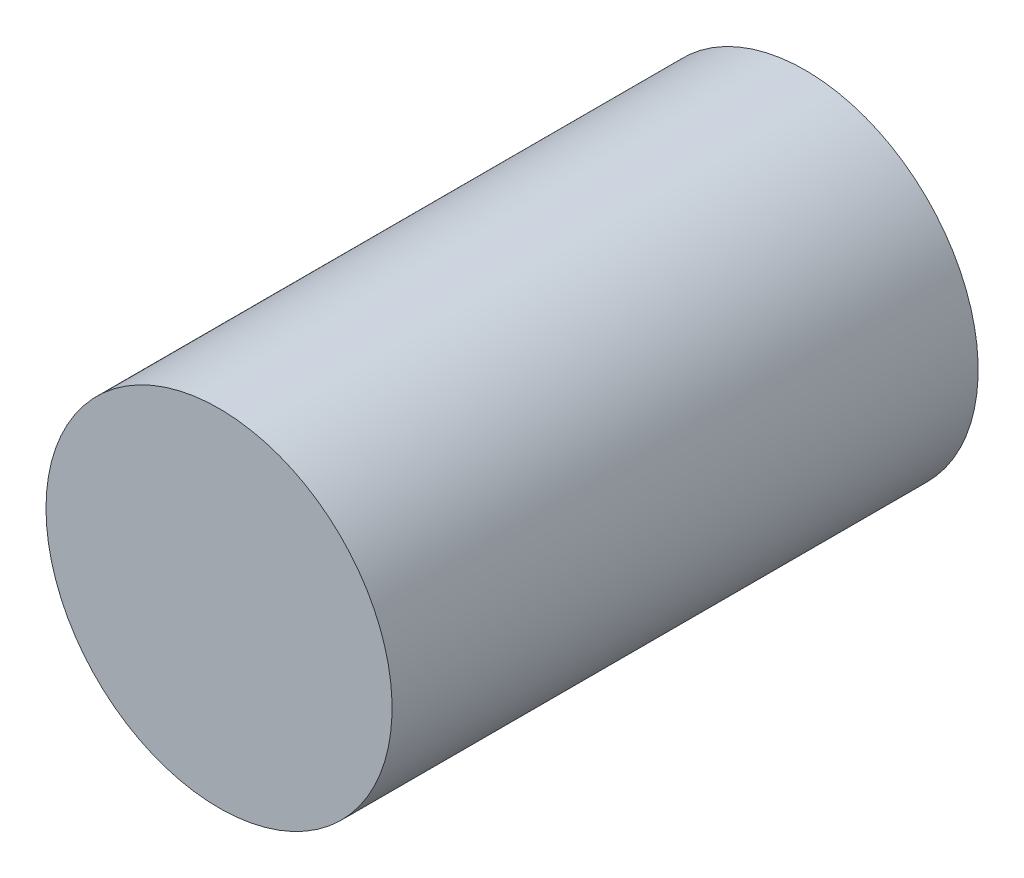
ISO-10303-21;
HEADER;
FILE_DESCRIPTION(('STEP AP214'),'2;1');
FILE_NAME('part.step','',(''),(''),'','','');
FILE_SCHEMA(('AUTOMOTIVE_DESIGN { 1 0 10303 214 1 1 1 1 }'));
ENDSEC;
DATA;
#1=APPLICATION_CONTEXT('core data for automotive mechanical design processes');
#2=APPLICATION_PROTOCOL_DEFINITION('international standard','automotive_design',2000,#1);
#3=PRODUCT_CONTEXT('',#1,'mechanical');
#4=PRODUCT('Part','Part','',(#3));
#5=PRODUCT_RELATED_PRODUCT_CATEGORY('part','',(#4));
#6=PRODUCT_DEFINITION_FORMATION('','',#4);
#7=PRODUCT_DEFINITION_CONTEXT('part definition',#1,'design');
#8=PRODUCT_DEFINITION('design','',#6,#7);
#9=PRODUCT_DEFINITION_SHAPE('','',#8);
#10=(LENGTH_UNIT() NAMED_UNIT(*) SI_UNIT(.MILLI.,.METRE.));
#11=(NAMED_UNIT(*) PLANE_ANGLE_UNIT() SI_UNIT($,.RADIAN.));
#12=(NAMED_UNIT(*) SI_UNIT($,.STERADIAN.) SOLID_ANGLE_UNIT());
#13=UNCERTAINTY_MEASURE_WITH_UNIT(LENGTH_MEASURE(1.E-05),#10,'distance_accuracy_value','');
#14=(GEOMETRIC_REPRESENTATION_CONTEXT(3) GLOBAL_UNCERTAINTY_ASSIGNED_CONTEXT((#13)) GLOBAL_UNIT_ASSIGNED_CONTEXT((#10,
#11,#12)) REPRESENTATION_CONTEXT('',''));
#15=CARTESIAN_POINT('',(0.,0.,0.));
#16=DIRECTION('',(0.,0.,1.));
#17=DIRECTION('',(1.,0.,0.));
#18=AXIS2_PLACEMENT_3D('',#15,#16,#17);
#19=CARTESIAN_POINT('',(0.,0.,21.));
#20=DIRECTION('',(0.,0.,-1.));
#21=DIRECTION('',(-1.,0.,0.));
#22=AXIS2_PLACEMENT_3D('',#19,#20,#21);
#23=CYLINDRICAL_SURFACE('',#22,6.2);
#24=CARTESIAN_POINT('',(0.,0.,21.));
#25=DIRECTION('',(0.,0.,1.));
#26=DIRECTION('',(1.,0.,0.));
#27=AXIS2_PLACEMENT_3D('',#24,#25,#26);
#28=CIRCLE('',#27,6.2);
#29=CARTESIAN_POINT('',(-6.2,0.,21.));
#30=VERTEX_POINT('',#29);
#31=EDGE_CURVE('E10',#30,#30,#28,.T.);
#32=CARTESIAN_POINT('',(0.,0.,0.));
#33=DIRECTION('',(0.,0.,1.));
#34=DIRECTION('',(1.,0.,0.));
#35=AXIS2_PLACEMENT_3D('',#32,#33,#34);
#36=CIRCLE('',#35,6.2);
#37=CARTESIAN_POINT('',(-6.2,0.,0.));
#38=VERTEX_POINT('',#37);
#39=EDGE_CURVE('E44',#38,#38,#36,.T.);
#40=CARTESIAN_POINT('',(-6.2,0.,21.));
#41=CARTESIAN_POINT('',(-6.2,0.,20.78125));
#42=CARTESIAN_POINT('',(-6.2,0.,20.5625));
#43=CARTESIAN_POINT('',(-6.2,0.,20.125));
#44=CARTESIAN_POINT('',(-6.2,0.,19.90625));
#45=CARTESIAN_POINT('',(-6.2,0.,19.46875));
#46=CARTESIAN_POINT('',(-6.2,0.,19.25));
#47=CARTESIAN_POINT('',(-6.2,0.,18.8125));
#48=CARTESIAN_POINT('',(-6.2,0.,18.59375));
#49=CARTESIAN_POINT('',(-6.2,0.,18.15625));
#50=CARTESIAN_POINT('',(-6.2,0.,17.9375));
#51=CARTESIAN_POINT('',(-6.2,0.,17.5));
#52=CARTESIAN_POINT('',(-6.2,0.,17.28125));
#53=CARTESIAN_POINT('',(-6.2,0.,16.84375));
#54=CARTESIAN_POINT('',(-6.2,0.,16.625));
#55=CARTESIAN_POINT('',(-6.2,0.,16.1875));
#56=CARTESIAN_POINT('',(-6.2,0.,15.96875));
#57=CARTESIAN_POINT('',(-6.2,0.,15.53125));
#58=CARTESIAN_POINT('',(-6.2,0.,15.3125));
#59=CARTESIAN_POINT('',(-6.2,0.,14.875));
#60=CARTESIAN_POINT('',(-6.2,0.,14.65625));
#61=CARTESIAN_POINT('',(-6.2,0.,14.21875));
#62=CARTESIAN_POINT('',(-6.2,0.,14.));
#63=CARTESIAN_POINT('',(-6.2,0.,13.5625));
#64=CARTESIAN_POINT('',(-6.2,0.,13.34375));
#65=CARTESIAN_POINT('',(-6.2,0.,12.90625));
#66=CARTESIAN_POINT('',(-6.2,0.,12.6875));
#67=CARTESIAN_POINT('',(-6.2,0.,12.25));
#68=CARTESIAN_POINT('',(-6.2,0.,12.03125));
#69=CARTESIAN_POINT('',(-6.2,0.,11.59375));
#70=CARTESIAN_POINT('',(-6.2,0.,11.375));
#71=CARTESIAN_POINT('',(-6.2,0.,10.9375));
#72=CARTESIAN_POINT('',(-6.2,0.,10.71875));
#73=CARTESIAN_POINT('',(-6.2,0.,10.28125));
#74=CARTESIAN_POINT('',(-6.2,0.,10.0625));
#75=CARTESIAN_POINT('',(-6.2,0.,9.625));
#76=CARTESIAN_POINT('',(-6.2,0.,9.40625));
#77=CARTESIAN_POINT('',(-6.2,0.,8.96875));
#78=CARTESIAN_POINT('',(-6.2,0.,8.75));
#79=CARTESIAN_POINT('',(-6.2,0.,8.3125));
#80=CARTESIAN_POINT('',(-6.2,0.,8.09375));
#81=CARTESIAN_POINT('',(-6.2,0.,7.65625));
#82=CARTESIAN_POINT('',(-6.2,0.,7.4375));
#83=CARTESIAN_POINT('',(-6.2,0.,7.));
#84=CARTESIAN_POINT('',(-6.2,0.,6.78125));
#85=CARTESIAN_POINT('',(-6.2,0.,6.34375));
#86=CARTESIAN_POINT('',(-6.2,0.,6.125));
#87=CARTESIAN_POINT('',(-6.2,0.,5.6875));
#88=CARTESIAN_POINT('',(-6.2,0.,5.46875));
#89=CARTESIAN_POINT('',(-6.2,0.,5.03125));
#90=CARTESIAN_POINT('',(-6.2,0.,4.8125));
#91=CARTESIAN_POINT('',(-6.2,0.,4.375));
#92=CARTESIAN_POINT('',(-6.2,0.,4.15625));
#93=CARTESIAN_POINT('',(-6.2,0.,3.71875));
#94=CARTESIAN_POINT('',(-6.2,0.,3.5));
#95=CARTESIAN_POINT('',(-6.2,0.,3.0625));
#96=CARTESIAN_POINT('',(-6.2,0.,2.84375));
#97=CARTESIAN_POINT('',(-6.2,0.,2.40625));
#98=CARTESIAN_POINT('',(-6.2,0.,2.1875));
#99=CARTESIAN_POINT('',(-6.2,0.,1.75));
#100=CARTESIAN_POINT('',(-6.2,0.,1.53125));
#101=CARTESIAN_POINT('',(-6.2,0.,1.09375));
#102=CARTESIAN_POINT('',(-6.2,0.,0.875000000000001));
#103=CARTESIAN_POINT('',(-6.2,0.,0.4375));
#104=CARTESIAN_POINT('',(-6.2,0.,0.21875));
#105=CARTESIAN_POINT('',(-6.2,0.,0.));
#106=B_SPLINE_CURVE_WITH_KNOTS('',3,(#40,#41,#42,#43,#44,#45,#46,#47,#48,#49,#50,#51,#52,#53,
#54,#55,#56,#57,#58,#59,#60,#61,#62,#63,#64,#65,#66,#67,#68,#69,#70,#71,#72,#73,#74,#75,#76,#77,
#78,#79,#80,#81,#82,#83,#84,#85,#86,#87,#88,#89,#90,#91,#92,#93,#94,#95,#96,#97,#98,#99,#100,
#101,#102,#103,#104,#105),.UNSPECIFIED.,.F.,.F.,(4,2,2,2,2,2,2,2,2,2,2,2,2,2,2,2,2,2,2,2,2,2,2,
2,2,2,2,2,2,2,2,2,4),(0.,0.656250000000001,1.3125,1.96875,2.625,3.28125,3.9375,4.59375,5.25,
5.90625,6.5625,7.21875,7.875,8.53125,9.1875,9.84375,10.5,11.15625,11.8125,12.46875,13.125,
13.78125,14.4375,15.09375,15.75,16.40625,17.0625,17.71875,18.375,19.03125,19.6875,20.34375,21.),.UNSPECIFIED.);
#107=EDGE_CURVE('BSEAM41',#30,#38,#106,.T.);
#108=ORIENTED_EDGE('',*,*,#31,.F.);
#109=ORIENTED_EDGE('',*,*,#39,.T.);
#110=ORIENTED_EDGE('',*,*,#107,.T.);
#111=ORIENTED_EDGE('',*,*,#107,.F.);
#112=EDGE_LOOP('',(#108,#110,#109,#111));
#113=FACE_BOUND('',#112,.T.);
#114=ADVANCED_FACE('F41',(#113),#23,.T.);
#115=CARTESIAN_POINT('',(0.,0.,21.));
#116=DIRECTION('',(0.,0.,1.));
#117=DIRECTION('',(1.,0.,0.));
#118=AXIS2_PLACEMENT_3D('',#115,#116,#117);
#119=PLANE('',#118);
#120=ORIENTED_EDGE('',*,*,#31,.T.);
#121=EDGE_LOOP('',(#120));
#122=FACE_BOUND('',#121,.T.);
#123=ADVANCED_FACE('F58',(#122),#119,.T.);
#124=CARTESIAN_POINT('',(0.,0.,0.));
#125=DIRECTION('',(0.,0.,1.));
#126=DIRECTION('',(1.,0.,0.));
#127=AXIS2_PLACEMENT_3D('',#124,#125,#126);
#128=PLANE('',#127);
#129=ORIENTED_EDGE('',*,*,#39,.F.);
#130=EDGE_LOOP('',(#129));
#131=FACE_BOUND('',#130,.T.);
#132=ADVANCED_FACE('F56',(#131),#128,.F.);
#133=CLOSED_SHELL('',(#114,#123,#132));
#134=MANIFOLD_SOLID_BREP('B2',#133);
#135=ADVANCED_BREP_SHAPE_REPRESENTATION('',(#18,#134),#14);
#136=SHAPE_DEFINITION_REPRESENTATION(#9,#135);
ENDSEC;
END-ISO-10303-21;
